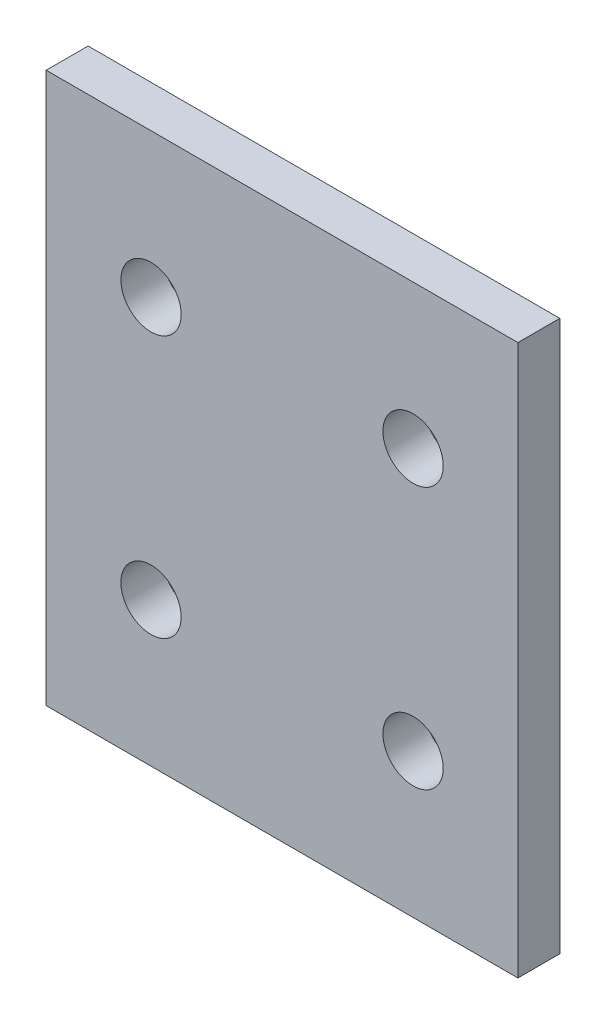
ISO-10303-21;
HEADER;
FILE_DESCRIPTION(('STEP AP214'),'2;1');
FILE_NAME('part.step','',(''),(''),'','','');
FILE_SCHEMA(('AUTOMOTIVE_DESIGN { 1 0 10303 214 1 1 1 1 }'));
ENDSEC;
DATA;
#1=APPLICATION_CONTEXT('core data for automotive mechanical design processes');
#2=APPLICATION_PROTOCOL_DEFINITION('international standard','automotive_design',2000,#1);
#3=PRODUCT_CONTEXT('',#1,'mechanical');
#4=PRODUCT('Part','Part','',(#3));
#5=PRODUCT_RELATED_PRODUCT_CATEGORY('part','',(#4));
#6=PRODUCT_DEFINITION_FORMATION('','',#4);
#7=PRODUCT_DEFINITION_CONTEXT('part definition',#1,'design');
#8=PRODUCT_DEFINITION('design','',#6,#7);
#9=PRODUCT_DEFINITION_SHAPE('','',#8);
#10=(LENGTH_UNIT() NAMED_UNIT(*) SI_UNIT(.MILLI.,.METRE.));
#11=(NAMED_UNIT(*) PLANE_ANGLE_UNIT() SI_UNIT($,.RADIAN.));
#12=(NAMED_UNIT(*) SI_UNIT($,.STERADIAN.) SOLID_ANGLE_UNIT());
#13=UNCERTAINTY_MEASURE_WITH_UNIT(LENGTH_MEASURE(1.E-05),#10,'distance_accuracy_value','');
#14=(GEOMETRIC_REPRESENTATION_CONTEXT(3) GLOBAL_UNCERTAINTY_ASSIGNED_CONTEXT((#13)) GLOBAL_UNIT_ASSIGNED_CONTEXT((#10,
#11,#12)) REPRESENTATION_CONTEXT('',''));
#15=CARTESIAN_POINT('',(0.,0.,0.));
#16=DIRECTION('',(0.,0.,1.));
#17=DIRECTION('',(1.,0.,0.));
#18=AXIS2_PLACEMENT_3D('',#15,#16,#17);
#19=CARTESIAN_POINT('',(0.,0.,-16.));
#20=DIRECTION('',(-1.,0.,0.));
#21=DIRECTION('',(0.,-1.,0.));
#22=AXIS2_PLACEMENT_3D('',#19,#20,#21);
#23=PLANE('',#22);
#24=DIRECTION('',(0.,-1.,0.));
#25=VECTOR('',#24,1.);
#26=CARTESIAN_POINT('',(0.,0.,0.));
#27=LINE('',#26,#25);
#28=CARTESIAN_POINT('',(0.,0.,0.));
#29=VERTEX_POINT('',#28);
#30=CARTESIAN_POINT('',(0.,-209.999999999999,0.));
#31=VERTEX_POINT('',#30);
#32=EDGE_CURVE('E101',#29,#31,#27,.T.);
#33=ORIENTED_EDGE('',*,*,#32,.F.);
#34=DIRECTION('',(0.,0.,1.));
#35=VECTOR('',#34,1.);
#36=CARTESIAN_POINT('',(0.,0.,-16.));
#37=LINE('',#36,#35);
#38=CARTESIAN_POINT('',(0.,0.,-16.));
#39=VERTEX_POINT('',#38);
#40=EDGE_CURVE('E11',#39,#29,#37,.T.);
#41=ORIENTED_EDGE('',*,*,#40,.F.);
#42=DIRECTION('',(0.,-1.,0.));
#43=VECTOR('',#42,1.);
#44=CARTESIAN_POINT('',(0.,0.,-16.));
#45=LINE('',#44,#43);
#46=CARTESIAN_POINT('',(0.,-209.999999999999,-16.));
#47=VERTEX_POINT('',#46);
#48=EDGE_CURVE('E94',#39,#47,#45,.T.);
#49=ORIENTED_EDGE('',*,*,#48,.T.);
#50=DIRECTION('',(0.,0.,1.));
#51=VECTOR('',#50,1.);
#52=CARTESIAN_POINT('',(0.,-209.999999999999,-16.));
#53=LINE('',#52,#51);
#54=EDGE_CURVE('E39',#47,#31,#53,.T.);
#55=ORIENTED_EDGE('',*,*,#54,.T.);
#56=EDGE_LOOP('',(#33,#41,#49,#55));
#57=FACE_BOUND('',#56,.T.);
#58=ADVANCED_FACE('F36',(#57),#23,.T.);
#59=CARTESIAN_POINT('',(0.,0.,-16.));
#60=DIRECTION('',(0.,1.,0.));
#61=DIRECTION('',(0.,0.,1.));
#62=AXIS2_PLACEMENT_3D('',#59,#60,#61);
#63=PLANE('',#62);
#64=DIRECTION('',(-1.,0.,0.));
#65=VECTOR('',#64,1.);
#66=CARTESIAN_POINT('',(0.,0.,0.));
#67=LINE('',#66,#65);
#68=CARTESIAN_POINT('',(180.,0.,0.));
#69=VERTEX_POINT('',#68);
#70=EDGE_CURVE('E96',#69,#29,#67,.T.);
#71=ORIENTED_EDGE('',*,*,#70,.F.);
#72=DIRECTION('',(0.,0.,1.));
#73=VECTOR('',#72,1.);
#74=CARTESIAN_POINT('',(180.,0.,-15.9999999999999));
#75=LINE('',#74,#73);
#76=CARTESIAN_POINT('',(180.,0.,-15.9999999999999));
#77=VERTEX_POINT('',#76);
#78=EDGE_CURVE('E45',#77,#69,#75,.T.);
#79=ORIENTED_EDGE('',*,*,#78,.F.);
#80=DIRECTION('',(-1.,0.,0.));
#81=VECTOR('',#80,1.);
#82=CARTESIAN_POINT('',(0.,0.,-16.));
#83=LINE('',#82,#81);
#84=EDGE_CURVE('E91',#77,#39,#83,.T.);
#85=ORIENTED_EDGE('',*,*,#84,.T.);
#86=ORIENTED_EDGE('',*,*,#40,.T.);
#87=EDGE_LOOP('',(#71,#79,#85,#86));
#88=FACE_BOUND('',#87,.T.);
#89=ADVANCED_FACE('F112',(#88),#63,.T.);
#90=CARTESIAN_POINT('',(180.,0.,-15.9999999999999));
#91=DIRECTION('',(1.,0.,0.));
#92=DIRECTION('',(0.,0.,-1.));
#93=AXIS2_PLACEMENT_3D('',#90,#91,#92);
#94=PLANE('',#93);
#95=DIRECTION('',(0.,1.,0.));
#96=VECTOR('',#95,1.);
#97=CARTESIAN_POINT('',(180.,0.,0.));
#98=LINE('',#97,#96);
#99=CARTESIAN_POINT('',(180.,-209.999999999999,0.));
#100=VERTEX_POINT('',#99);
#101=EDGE_CURVE('E86',#100,#69,#98,.T.);
#102=ORIENTED_EDGE('',*,*,#101,.F.);
#103=DIRECTION('',(0.,0.,1.));
#104=VECTOR('',#103,1.);
#105=CARTESIAN_POINT('',(180.,-209.999999999999,-16.));
#106=LINE('',#105,#104);
#107=CARTESIAN_POINT('',(180.,-209.999999999999,-16.));
#108=VERTEX_POINT('',#107);
#109=EDGE_CURVE('E81',#108,#100,#106,.T.);
#110=ORIENTED_EDGE('',*,*,#109,.F.);
#111=DIRECTION('',(0.,1.,0.));
#112=VECTOR('',#111,1.);
#113=CARTESIAN_POINT('',(180.,0.,-15.9999999999999));
#114=LINE('',#113,#112);
#115=EDGE_CURVE('E84',#108,#77,#114,.T.);
#116=ORIENTED_EDGE('',*,*,#115,.T.);
#117=ORIENTED_EDGE('',*,*,#78,.T.);
#118=EDGE_LOOP('',(#102,#110,#116,#117));
#119=FACE_BOUND('',#118,.T.);
#120=ADVANCED_FACE('F83',(#119),#94,.T.);
#121=CARTESIAN_POINT('',(0.,-209.999999999999,-16.));
#122=DIRECTION('',(0.,-1.,0.));
#123=DIRECTION('',(0.,0.,-1.));
#124=AXIS2_PLACEMENT_3D('',#121,#122,#123);
#125=PLANE('',#124);
#126=DIRECTION('',(1.,0.,0.));
#127=VECTOR('',#126,1.);
#128=CARTESIAN_POINT('',(0.,-209.999999999999,0.));
#129=LINE('',#128,#127);
#130=EDGE_CURVE('E104',#31,#100,#129,.T.);
#131=ORIENTED_EDGE('',*,*,#130,.F.);
#132=ORIENTED_EDGE('',*,*,#54,.F.);
#133=DIRECTION('',(1.,0.,0.));
#134=VECTOR('',#133,1.);
#135=CARTESIAN_POINT('',(0.,-209.999999999999,-16.));
#136=LINE('',#135,#134);
#137=EDGE_CURVE('E90',#47,#108,#136,.T.);
#138=ORIENTED_EDGE('',*,*,#137,.T.);
#139=ORIENTED_EDGE('',*,*,#109,.T.);
#140=EDGE_LOOP('',(#131,#132,#138,#139));
#141=FACE_BOUND('',#140,.T.);
#142=ADVANCED_FACE('F93',(#141),#125,.T.);
#143=CARTESIAN_POINT('',(0.,0.,-16.));
#144=DIRECTION('',(0.,0.,1.));
#145=DIRECTION('',(1.,0.,0.));
#146=AXIS2_PLACEMENT_3D('',#143,#144,#145);
#147=PLANE('',#146);
#148=CARTESIAN_POINT('',(40.,-155.,-16.));
#149=DIRECTION('',(0.,0.,1.));
#150=DIRECTION('',(-1.,0.,0.));
#151=AXIS2_PLACEMENT_3D('',#148,#149,#150);
#152=CIRCLE('',#151,11.5);
#153=CARTESIAN_POINT('',(28.5,-155.,-16.));
#154=VERTEX_POINT('',#153);
#155=EDGE_CURVE('E153',#154,#154,#152,.T.);
#156=ORIENTED_EDGE('',*,*,#155,.T.);
#157=EDGE_LOOP('',(#156));
#158=FACE_BOUND('',#157,.T.);
#159=CARTESIAN_POINT('',(140.,-155.,-16.));
#160=DIRECTION('',(0.,0.,1.));
#161=DIRECTION('',(1.,0.,0.));
#162=AXIS2_PLACEMENT_3D('',#159,#160,#161);
#163=CIRCLE('',#162,11.5);
#164=CARTESIAN_POINT('',(151.5,-155.,-16.));
#165=VERTEX_POINT('',#164);
#166=EDGE_CURVE('E161',#165,#165,#163,.T.);
#167=ORIENTED_EDGE('',*,*,#166,.T.);
#168=EDGE_LOOP('',(#167));
#169=FACE_BOUND('',#168,.T.);
#170=CARTESIAN_POINT('',(140.,-55.0000000000002,-16.));
#171=DIRECTION('',(0.,0.,1.));
#172=DIRECTION('',(-1.,0.,0.));
#173=AXIS2_PLACEMENT_3D('',#170,#171,#172);
#174=CIRCLE('',#173,11.5);
#175=CARTESIAN_POINT('',(128.5,-55.0000000000002,-16.));
#176=VERTEX_POINT('',#175);
#177=EDGE_CURVE('E167',#176,#176,#174,.T.);
#178=ORIENTED_EDGE('',*,*,#177,.T.);
#179=EDGE_LOOP('',(#178));
#180=FACE_BOUND('',#179,.T.);
#181=CARTESIAN_POINT('',(40.,-55.0000000000002,-16.));
#182=DIRECTION('',(0.,0.,1.));
#183=DIRECTION('',(1.,0.,0.));
#184=AXIS2_PLACEMENT_3D('',#181,#182,#183);
#185=CIRCLE('',#184,11.5);
#186=CARTESIAN_POINT('',(51.5000000000001,-55.0000000000002,-16.));
#187=VERTEX_POINT('',#186);
#188=EDGE_CURVE('E105',#187,#187,#185,.T.);
#189=ORIENTED_EDGE('',*,*,#188,.T.);
#190=EDGE_LOOP('',(#189));
#191=FACE_BOUND('',#190,.T.);
#192=ORIENTED_EDGE('',*,*,#48,.F.);
#193=ORIENTED_EDGE('',*,*,#84,.F.);
#194=ORIENTED_EDGE('',*,*,#115,.F.);
#195=ORIENTED_EDGE('',*,*,#137,.F.);
#196=EDGE_LOOP('',(#192,#193,#194,#195));
#197=FACE_BOUND('',#196,.T.);
#198=ADVANCED_FACE('F89',(#158,#169,#180,#191,#197),#147,.F.);
#199=CARTESIAN_POINT('',(0.,0.,0.));
#200=DIRECTION('',(0.,0.,1.));
#201=DIRECTION('',(1.,0.,0.));
#202=AXIS2_PLACEMENT_3D('',#199,#200,#201);
#203=PLANE('',#202);
#204=CARTESIAN_POINT('',(40.,-155.,0.));
#205=DIRECTION('',(0.,0.,1.));
#206=DIRECTION('',(-1.,0.,0.));
#207=AXIS2_PLACEMENT_3D('',#204,#205,#206);
#208=CIRCLE('',#207,11.5);
#209=CARTESIAN_POINT('',(28.5,-155.,0.));
#210=VERTEX_POINT('',#209);
#211=EDGE_CURVE('E156',#210,#210,#208,.T.);
#212=ORIENTED_EDGE('',*,*,#211,.F.);
#213=EDGE_LOOP('',(#212));
#214=FACE_BOUND('',#213,.T.);
#215=CARTESIAN_POINT('',(140.,-155.,0.));
#216=DIRECTION('',(0.,0.,1.));
#217=DIRECTION('',(1.,0.,0.));
#218=AXIS2_PLACEMENT_3D('',#215,#216,#217);
#219=CIRCLE('',#218,11.5);
#220=CARTESIAN_POINT('',(151.5,-155.,0.));
#221=VERTEX_POINT('',#220);
#222=EDGE_CURVE('E158',#221,#221,#219,.T.);
#223=ORIENTED_EDGE('',*,*,#222,.F.);
#224=EDGE_LOOP('',(#223));
#225=FACE_BOUND('',#224,.T.);
#226=CARTESIAN_POINT('',(140.,-55.0000000000002,0.));
#227=DIRECTION('',(0.,0.,1.));
#228=DIRECTION('',(-1.,0.,0.));
#229=AXIS2_PLACEMENT_3D('',#226,#227,#228);
#230=CIRCLE('',#229,11.5);
#231=CARTESIAN_POINT('',(128.5,-55.0000000000002,0.));
#232=VERTEX_POINT('',#231);
#233=EDGE_CURVE('E164',#232,#232,#230,.T.);
#234=ORIENTED_EDGE('',*,*,#233,.F.);
#235=EDGE_LOOP('',(#234));
#236=FACE_BOUND('',#235,.T.);
#237=CARTESIAN_POINT('',(40.,-55.0000000000002,0.));
#238=DIRECTION('',(0.,0.,1.));
#239=DIRECTION('',(1.,0.,0.));
#240=AXIS2_PLACEMENT_3D('',#237,#238,#239);
#241=CIRCLE('',#240,11.5);
#242=CARTESIAN_POINT('',(51.5000000000001,-55.0000000000002,0.));
#243=VERTEX_POINT('',#242);
#244=EDGE_CURVE('E170',#243,#243,#241,.T.);
#245=ORIENTED_EDGE('',*,*,#244,.F.);
#246=EDGE_LOOP('',(#245));
#247=FACE_BOUND('',#246,.T.);
#248=ORIENTED_EDGE('',*,*,#32,.T.);
#249=ORIENTED_EDGE('',*,*,#130,.T.);
#250=ORIENTED_EDGE('',*,*,#101,.T.);
#251=ORIENTED_EDGE('',*,*,#70,.T.);
#252=EDGE_LOOP('',(#248,#249,#250,#251));
#253=FACE_BOUND('',#252,.T.);
#254=ADVANCED_FACE('F111',(#214,#225,#236,#247,#253),#203,.T.);
#255=CARTESIAN_POINT('',(40.,-55.0000000000002,-16.));
#256=DIRECTION('',(0.,0.,1.));
#257=DIRECTION('',(1.,0.,0.));
#258=AXIS2_PLACEMENT_3D('',#255,#256,#257);
#259=CYLINDRICAL_SURFACE('',#258,11.5);
#260=ORIENTED_EDGE('',*,*,#188,.F.);
#261=EDGE_LOOP('',(#260));
#262=FACE_BOUND('',#261,.T.);
#263=ORIENTED_EDGE('',*,*,#244,.T.);
#264=EDGE_LOOP('',(#263));
#265=FACE_BOUND('',#264,.T.);
#266=ADVANCED_FACE('F130',(#262,#265),#259,.F.);
#267=CARTESIAN_POINT('',(140.,-55.0000000000002,-16.));
#268=DIRECTION('',(0.,0.,1.));
#269=DIRECTION('',(1.,0.,0.));
#270=AXIS2_PLACEMENT_3D('',#267,#268,#269);
#271=CYLINDRICAL_SURFACE('',#270,11.5);
#272=ORIENTED_EDGE('',*,*,#177,.F.);
#273=EDGE_LOOP('',(#272));
#274=FACE_BOUND('',#273,.T.);
#275=ORIENTED_EDGE('',*,*,#233,.T.);
#276=EDGE_LOOP('',(#275));
#277=FACE_BOUND('',#276,.T.);
#278=ADVANCED_FACE('F137',(#274,#277),#271,.F.);
#279=CARTESIAN_POINT('',(140.,-155.,-16.));
#280=DIRECTION('',(0.,0.,1.));
#281=DIRECTION('',(1.,0.,0.));
#282=AXIS2_PLACEMENT_3D('',#279,#280,#281);
#283=CYLINDRICAL_SURFACE('',#282,11.5);
#284=ORIENTED_EDGE('',*,*,#166,.F.);
#285=EDGE_LOOP('',(#284));
#286=FACE_BOUND('',#285,.T.);
#287=ORIENTED_EDGE('',*,*,#222,.T.);
#288=EDGE_LOOP('',(#287));
#289=FACE_BOUND('',#288,.T.);
#290=ADVANCED_FACE('F141',(#286,#289),#283,.F.);
#291=CARTESIAN_POINT('',(40.,-155.,-16.));
#292=DIRECTION('',(0.,0.,1.));
#293=DIRECTION('',(1.,0.,0.));
#294=AXIS2_PLACEMENT_3D('',#291,#292,#293);
#295=CYLINDRICAL_SURFACE('',#294,11.5);
#296=ORIENTED_EDGE('',*,*,#155,.F.);
#297=EDGE_LOOP('',(#296));
#298=FACE_BOUND('',#297,.T.);
#299=ORIENTED_EDGE('',*,*,#211,.T.);
#300=EDGE_LOOP('',(#299));
#301=FACE_BOUND('',#300,.T.);
#302=ADVANCED_FACE('F145',(#298,#301),#295,.F.);
#303=CLOSED_SHELL('',(#58,#89,#120,#142,#198,#254,#266,#278,#290,#302));
#304=MANIFOLD_SOLID_BREP('B2',#303);
#305=ADVANCED_BREP_SHAPE_REPRESENTATION('',(#18,#304),#14);
#306=SHAPE_DEFINITION_REPRESENTATION(#9,#305);
ENDSEC;
END-ISO-10303-21;
